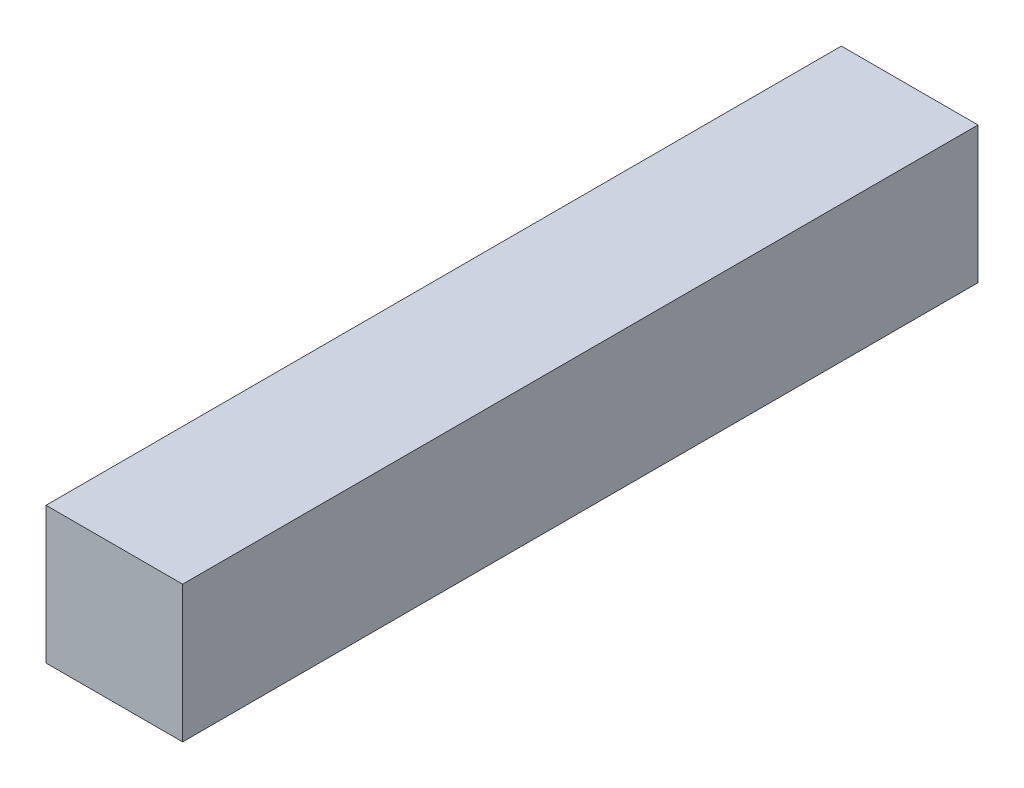
ISO-10303-21;
HEADER;
FILE_DESCRIPTION(('STEP AP214'),'2;1');
FILE_NAME('part.step','',(''),(''),'','','');
FILE_SCHEMA(('AUTOMOTIVE_DESIGN { 1 0 10303 214 1 1 1 1 }'));
ENDSEC;
DATA;
#1=APPLICATION_CONTEXT('core data for automotive mechanical design processes');
#2=APPLICATION_PROTOCOL_DEFINITION('international standard','automotive_design',2000,#1);
#3=PRODUCT_CONTEXT('',#1,'mechanical');
#4=PRODUCT('Part','Part','',(#3));
#5=PRODUCT_RELATED_PRODUCT_CATEGORY('part','',(#4));
#6=PRODUCT_DEFINITION_FORMATION('','',#4);
#7=PRODUCT_DEFINITION_CONTEXT('part definition',#1,'design');
#8=PRODUCT_DEFINITION('design','',#6,#7);
#9=PRODUCT_DEFINITION_SHAPE('','',#8);
#10=(LENGTH_UNIT() NAMED_UNIT(*) SI_UNIT(.MILLI.,.METRE.));
#11=(NAMED_UNIT(*) PLANE_ANGLE_UNIT() SI_UNIT($,.RADIAN.));
#12=(NAMED_UNIT(*) SI_UNIT($,.STERADIAN.) SOLID_ANGLE_UNIT());
#13=UNCERTAINTY_MEASURE_WITH_UNIT(LENGTH_MEASURE(1.E-05),#10,'distance_accuracy_value','');
#14=(GEOMETRIC_REPRESENTATION_CONTEXT(3) GLOBAL_UNCERTAINTY_ASSIGNED_CONTEXT((#13)) GLOBAL_UNIT_ASSIGNED_CONTEXT((#10,
#11,#12)) REPRESENTATION_CONTEXT('',''));
#15=CARTESIAN_POINT('',(0.,0.,0.));
#16=DIRECTION('',(0.,0.,1.));
#17=DIRECTION('',(1.,0.,0.));
#18=AXIS2_PLACEMENT_3D('',#15,#16,#17);
#19=CARTESIAN_POINT('',(13.090860407,-13.090860407,76.2));
#20=DIRECTION('',(-1.,0.,0.));
#21=DIRECTION('',(0.,0.,1.));
#22=AXIS2_PLACEMENT_3D('',#19,#20,#21);
#23=PLANE('',#22);
#24=DIRECTION('',(0.,1.,0.));
#25=VECTOR('',#24,1.);
#26=CARTESIAN_POINT('',(13.090860407,-13.090860407,-76.2));
#27=LINE('',#26,#25);
#28=CARTESIAN_POINT('',(13.090860407,-13.090860407,-76.2));
#29=VERTEX_POINT('',#28);
#30=CARTESIAN_POINT('',(13.090860407,13.090860407,-76.2));
#31=VERTEX_POINT('',#30);
#32=EDGE_CURVE('E97',#29,#31,#27,.T.);
#33=ORIENTED_EDGE('',*,*,#32,.T.);
#34=DIRECTION('',(0.,0.,-1.));
#35=VECTOR('',#34,1.);
#36=CARTESIAN_POINT('',(13.090860407,13.090860407,76.2));
#37=LINE('',#36,#35);
#38=CARTESIAN_POINT('',(13.090860407,13.090860407,76.2));
#39=VERTEX_POINT('',#38);
#40=EDGE_CURVE('E11',#39,#31,#37,.T.);
#41=ORIENTED_EDGE('',*,*,#40,.F.);
#42=DIRECTION('',(0.,1.,0.));
#43=VECTOR('',#42,1.);
#44=CARTESIAN_POINT('',(13.090860407,-13.090860407,76.2));
#45=LINE('',#44,#43);
#46=CARTESIAN_POINT('',(13.090860407,-13.090860407,76.2));
#47=VERTEX_POINT('',#46);
#48=EDGE_CURVE('E85',#47,#39,#45,.T.);
#49=ORIENTED_EDGE('',*,*,#48,.F.);
#50=DIRECTION('',(0.,0.,-1.));
#51=VECTOR('',#50,1.);
#52=CARTESIAN_POINT('',(13.090860407,-13.090860407,76.2));
#53=LINE('',#52,#51);
#54=EDGE_CURVE('E93',#47,#29,#53,.T.);
#55=ORIENTED_EDGE('',*,*,#54,.T.);
#56=EDGE_LOOP('',(#33,#41,#49,#55));
#57=FACE_BOUND('',#56,.T.);
#58=ADVANCED_FACE('F34',(#57),#23,.F.);
#59=CARTESIAN_POINT('',(-13.090860407,13.090860407,76.2));
#60=DIRECTION('',(0.,-1.,0.));
#61=DIRECTION('',(0.,0.,-1.));
#62=AXIS2_PLACEMENT_3D('',#59,#60,#61);
#63=PLANE('',#62);
#64=DIRECTION('',(-1.,0.,0.));
#65=VECTOR('',#64,1.);
#66=CARTESIAN_POINT('',(-13.090860407,13.090860407,-76.2));
#67=LINE('',#66,#65);
#68=CARTESIAN_POINT('',(-13.090860407,13.090860407,-76.2));
#69=VERTEX_POINT('',#68);
#70=EDGE_CURVE('E89',#31,#69,#67,.T.);
#71=ORIENTED_EDGE('',*,*,#70,.T.);
#72=DIRECTION('',(0.,0.,-1.));
#73=VECTOR('',#72,1.);
#74=CARTESIAN_POINT('',(-13.090860407,13.090860407,76.2));
#75=LINE('',#74,#73);
#76=CARTESIAN_POINT('',(-13.090860407,13.090860407,76.2));
#77=VERTEX_POINT('',#76);
#78=EDGE_CURVE('E42',#77,#69,#75,.T.);
#79=ORIENTED_EDGE('',*,*,#78,.F.);
#80=DIRECTION('',(-1.,0.,0.));
#81=VECTOR('',#80,1.);
#82=CARTESIAN_POINT('',(-13.090860407,13.090860407,76.2));
#83=LINE('',#82,#81);
#84=EDGE_CURVE('E80',#39,#77,#83,.T.);
#85=ORIENTED_EDGE('',*,*,#84,.F.);
#86=ORIENTED_EDGE('',*,*,#40,.T.);
#87=EDGE_LOOP('',(#71,#79,#85,#86));
#88=FACE_BOUND('',#87,.T.);
#89=ADVANCED_FACE('F88',(#88),#63,.F.);
#90=CARTESIAN_POINT('',(-13.090860407,-13.090860407,76.2));
#91=DIRECTION('',(1.,0.,0.));
#92=DIRECTION('',(0.,0.,-1.));
#93=AXIS2_PLACEMENT_3D('',#90,#91,#92);
#94=PLANE('',#93);
#95=DIRECTION('',(0.,-1.,0.));
#96=VECTOR('',#95,1.);
#97=CARTESIAN_POINT('',(-13.090860407,-13.090860407,-76.2));
#98=LINE('',#97,#96);
#99=CARTESIAN_POINT('',(-13.090860407,-13.090860407,-76.2));
#100=VERTEX_POINT('',#99);
#101=EDGE_CURVE('E67',#69,#100,#98,.T.);
#102=ORIENTED_EDGE('',*,*,#101,.T.);
#103=DIRECTION('',(0.,0.,-1.));
#104=VECTOR('',#103,1.);
#105=CARTESIAN_POINT('',(-13.090860407,-13.090860407,76.2));
#106=LINE('',#105,#104);
#107=CARTESIAN_POINT('',(-13.090860407,-13.090860407,76.2));
#108=VERTEX_POINT('',#107);
#109=EDGE_CURVE('E90',#108,#100,#106,.T.);
#110=ORIENTED_EDGE('',*,*,#109,.F.);
#111=DIRECTION('',(0.,-1.,0.));
#112=VECTOR('',#111,1.);
#113=CARTESIAN_POINT('',(-13.090860407,-13.090860407,76.2));
#114=LINE('',#113,#112);
#115=EDGE_CURVE('E83',#77,#108,#114,.T.);
#116=ORIENTED_EDGE('',*,*,#115,.F.);
#117=ORIENTED_EDGE('',*,*,#78,.T.);
#118=EDGE_LOOP('',(#102,#110,#116,#117));
#119=FACE_BOUND('',#118,.T.);
#120=ADVANCED_FACE('F91',(#119),#94,.F.);
#121=CARTESIAN_POINT('',(-13.090860407,-13.090860407,76.2));
#122=DIRECTION('',(0.,1.,0.));
#123=DIRECTION('',(0.,0.,1.));
#124=AXIS2_PLACEMENT_3D('',#121,#122,#123);
#125=PLANE('',#124);
#126=DIRECTION('',(1.,0.,0.));
#127=VECTOR('',#126,1.);
#128=CARTESIAN_POINT('',(-13.090860407,-13.090860407,-76.2));
#129=LINE('',#128,#127);
#130=EDGE_CURVE('E73',#100,#29,#129,.T.);
#131=ORIENTED_EDGE('',*,*,#130,.T.);
#132=ORIENTED_EDGE('',*,*,#54,.F.);
#133=DIRECTION('',(1.,0.,0.));
#134=VECTOR('',#133,1.);
#135=CARTESIAN_POINT('',(-13.090860407,-13.090860407,76.2));
#136=LINE('',#135,#134);
#137=EDGE_CURVE('E50',#108,#47,#136,.T.);
#138=ORIENTED_EDGE('',*,*,#137,.F.);
#139=ORIENTED_EDGE('',*,*,#109,.T.);
#140=EDGE_LOOP('',(#131,#132,#138,#139));
#141=FACE_BOUND('',#140,.T.);
#142=ADVANCED_FACE('F104',(#141),#125,.F.);
#143=CARTESIAN_POINT('',(0.,0.,76.2));
#144=DIRECTION('',(0.,0.,-1.));
#145=DIRECTION('',(-1.,0.,0.));
#146=AXIS2_PLACEMENT_3D('',#143,#144,#145);
#147=PLANE('',#146);
#148=ORIENTED_EDGE('',*,*,#48,.T.);
#149=ORIENTED_EDGE('',*,*,#84,.T.);
#150=ORIENTED_EDGE('',*,*,#115,.T.);
#151=ORIENTED_EDGE('',*,*,#137,.T.);
#152=EDGE_LOOP('',(#148,#149,#150,#151));
#153=FACE_BOUND('',#152,.T.);
#154=ADVANCED_FACE('F81',(#153),#147,.F.);
#155=CARTESIAN_POINT('',(0.,0.,-76.2));
#156=DIRECTION('',(0.,0.,-1.));
#157=DIRECTION('',(-1.,0.,0.));
#158=AXIS2_PLACEMENT_3D('',#155,#156,#157);
#159=PLANE('',#158);
#160=ORIENTED_EDGE('',*,*,#32,.F.);
#161=ORIENTED_EDGE('',*,*,#130,.F.);
#162=ORIENTED_EDGE('',*,*,#101,.F.);
#163=ORIENTED_EDGE('',*,*,#70,.F.);
#164=EDGE_LOOP('',(#160,#161,#162,#163));
#165=FACE_BOUND('',#164,.T.);
#166=ADVANCED_FACE('F107',(#165),#159,.T.);
#167=CLOSED_SHELL('',(#58,#89,#120,#142,#154,#166));
#168=MANIFOLD_SOLID_BREP('B2',#167);
#169=ADVANCED_BREP_SHAPE_REPRESENTATION('',(#18,#168),#14);
#170=SHAPE_DEFINITION_REPRESENTATION(#9,#169);
ENDSEC;
END-ISO-10303-21;
